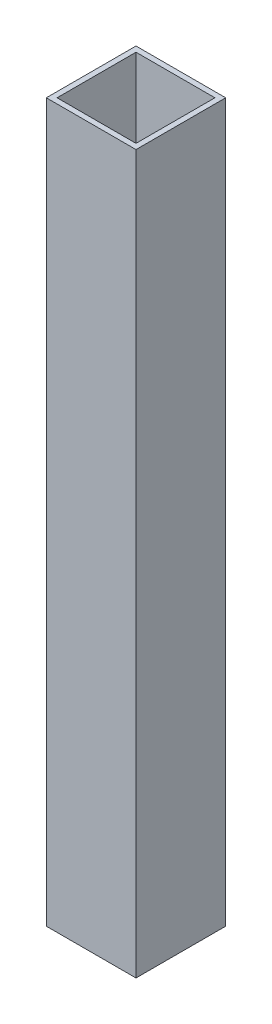
ISO-10303-21;
HEADER;
FILE_DESCRIPTION(('STEP AP214'),'2;1');
FILE_NAME('part.step','',(''),(''),'','','');
FILE_SCHEMA(('AUTOMOTIVE_DESIGN { 1 0 10303 214 1 1 1 1 }'));
ENDSEC;
DATA;
#1=APPLICATION_CONTEXT('core data for automotive mechanical design processes');
#2=APPLICATION_PROTOCOL_DEFINITION('international standard','automotive_design',2000,#1);
#3=PRODUCT_CONTEXT('',#1,'mechanical');
#4=PRODUCT('Part','Part','',(#3));
#5=PRODUCT_RELATED_PRODUCT_CATEGORY('part','',(#4));
#6=PRODUCT_DEFINITION_FORMATION('','',#4);
#7=PRODUCT_DEFINITION_CONTEXT('part definition',#1,'design');
#8=PRODUCT_DEFINITION('design','',#6,#7);
#9=PRODUCT_DEFINITION_SHAPE('','',#8);
#10=(LENGTH_UNIT() NAMED_UNIT(*) SI_UNIT(.MILLI.,.METRE.));
#11=(NAMED_UNIT(*) PLANE_ANGLE_UNIT() SI_UNIT($,.RADIAN.));
#12=(NAMED_UNIT(*) SI_UNIT($,.STERADIAN.) SOLID_ANGLE_UNIT());
#13=UNCERTAINTY_MEASURE_WITH_UNIT(LENGTH_MEASURE(1.E-05),#10,'distance_accuracy_value','');
#14=(GEOMETRIC_REPRESENTATION_CONTEXT(3) GLOBAL_UNCERTAINTY_ASSIGNED_CONTEXT((#13)) GLOBAL_UNIT_ASSIGNED_CONTEXT((#10,
#11,#12)) REPRESENTATION_CONTEXT('',''));
#15=CARTESIAN_POINT('',(0.,0.,0.));
#16=DIRECTION('',(0.,0.,1.));
#17=DIRECTION('',(1.,0.,0.));
#18=AXIS2_PLACEMENT_3D('',#15,#16,#17);
#19=CARTESIAN_POINT('',(0.,100.,0.));
#20=DIRECTION('',(0.,1.,0.));
#21=DIRECTION('',(0.,0.,1.));
#22=AXIS2_PLACEMENT_3D('',#19,#20,#21);
#23=PLANE('',#22);
#24=DIRECTION('',(0.,0.,1.));
#25=VECTOR('',#24,1.);
#26=CARTESIAN_POINT('',(-26.6277544150477,100.,-1.83717263154866));
#27=LINE('',#26,#25);
#28=CARTESIAN_POINT('',(-26.6277544150477,100.,-1.83717263154866));
#29=VERTEX_POINT('',#28);
#30=CARTESIAN_POINT('',(-26.6277544150477,100.,10.6628273684513));
#31=VERTEX_POINT('',#30);
#32=EDGE_CURVE('E138',#29,#31,#27,.T.);
#33=ORIENTED_EDGE('',*,*,#32,.T.);
#34=DIRECTION('',(1.,0.,0.));
#35=VECTOR('',#34,1.);
#36=CARTESIAN_POINT('',(-26.6277544150477,100.,10.6628273684513));
#37=LINE('',#36,#35);
#38=CARTESIAN_POINT('',(-14.1277544150477,100.,10.6628273684513));
#39=VERTEX_POINT('',#38);
#40=EDGE_CURVE('E141',#31,#39,#37,.T.);
#41=ORIENTED_EDGE('',*,*,#40,.T.);
#42=DIRECTION('',(0.,0.,-1.));
#43=VECTOR('',#42,1.);
#44=CARTESIAN_POINT('',(-14.1277544150477,100.,-1.83717263154866));
#45=LINE('',#44,#43);
#46=CARTESIAN_POINT('',(-14.1277544150477,100.,-1.83717263154866));
#47=VERTEX_POINT('',#46);
#48=EDGE_CURVE('E144',#39,#47,#45,.T.);
#49=ORIENTED_EDGE('',*,*,#48,.T.);
#50=DIRECTION('',(-1.,0.,0.));
#51=VECTOR('',#50,1.);
#52=CARTESIAN_POINT('',(-26.6277544150477,100.,-1.83717263154866));
#53=LINE('',#52,#51);
#54=EDGE_CURVE('E146',#47,#29,#53,.T.);
#55=ORIENTED_EDGE('',*,*,#54,.T.);
#56=EDGE_LOOP('',(#33,#41,#49,#55));
#57=FACE_BOUND('',#56,.T.);
#58=DIRECTION('',(-1.,0.,0.));
#59=VECTOR('',#58,1.);
#60=CARTESIAN_POINT('',(-25.8777544150477,100.,-1.08717263154866));
#61=LINE('',#60,#59);
#62=CARTESIAN_POINT('',(-14.8777544150477,100.,-1.08717263154866));
#63=VERTEX_POINT('',#62);
#64=CARTESIAN_POINT('',(-25.8777544150477,100.,-1.08717263154866));
#65=VERTEX_POINT('',#64);
#66=EDGE_CURVE('E110',#63,#65,#61,.T.);
#67=ORIENTED_EDGE('',*,*,#66,.F.);
#68=DIRECTION('',(0.,0.,-1.));
#69=VECTOR('',#68,1.);
#70=CARTESIAN_POINT('',(-14.8777544150477,100.,-1.08717263154866));
#71=LINE('',#70,#69);
#72=CARTESIAN_POINT('',(-14.8777544150477,100.,9.91282736845134));
#73=VERTEX_POINT('',#72);
#74=EDGE_CURVE('E102',#73,#63,#71,.T.);
#75=ORIENTED_EDGE('',*,*,#74,.F.);
#76=DIRECTION('',(1.,0.,0.));
#77=VECTOR('',#76,1.);
#78=CARTESIAN_POINT('',(-25.8777544150477,100.,9.91282736845134));
#79=LINE('',#78,#77);
#80=CARTESIAN_POINT('',(-25.8777544150477,100.,9.91282736845134));
#81=VERTEX_POINT('',#80);
#82=EDGE_CURVE('E124',#81,#73,#79,.T.);
#83=ORIENTED_EDGE('',*,*,#82,.F.);
#84=DIRECTION('',(0.,0.,1.));
#85=VECTOR('',#84,1.);
#86=CARTESIAN_POINT('',(-25.8777544150477,100.,-1.08717263154866));
#87=LINE('',#86,#85);
#88=EDGE_CURVE('E122',#65,#81,#87,.T.);
#89=ORIENTED_EDGE('',*,*,#88,.F.);
#90=EDGE_LOOP('',(#67,#75,#83,#89));
#91=FACE_BOUND('',#90,.T.);
#92=ADVANCED_FACE('F37',(#57,#91),#23,.T.);
#93=CARTESIAN_POINT('',(0.,0.,0.));
#94=DIRECTION('',(0.,1.,0.));
#95=DIRECTION('',(0.,0.,1.));
#96=AXIS2_PLACEMENT_3D('',#93,#94,#95);
#97=PLANE('',#96);
#98=DIRECTION('',(0.,0.,1.));
#99=VECTOR('',#98,1.);
#100=CARTESIAN_POINT('',(-26.6277544150477,0.,-1.83717263154866));
#101=LINE('',#100,#99);
#102=CARTESIAN_POINT('',(-26.6277544150477,0.,-1.83717263154866));
#103=VERTEX_POINT('',#102);
#104=CARTESIAN_POINT('',(-26.6277544150477,0.,10.6628273684513));
#105=VERTEX_POINT('',#104);
#106=EDGE_CURVE('E118',#103,#105,#101,.T.);
#107=ORIENTED_EDGE('',*,*,#106,.F.);
#108=DIRECTION('',(-1.,0.,0.));
#109=VECTOR('',#108,1.);
#110=CARTESIAN_POINT('',(-26.6277544150477,0.,-1.83717263154866));
#111=LINE('',#110,#109);
#112=CARTESIAN_POINT('',(-14.1277544150477,0.,-1.83717263154866));
#113=VERTEX_POINT('',#112);
#114=EDGE_CURVE('E142',#113,#103,#111,.T.);
#115=ORIENTED_EDGE('',*,*,#114,.F.);
#116=DIRECTION('',(0.,0.,-1.));
#117=VECTOR('',#116,1.);
#118=CARTESIAN_POINT('',(-14.1277544150477,0.,-1.83717263154866));
#119=LINE('',#118,#117);
#120=CARTESIAN_POINT('',(-14.1277544150477,0.,10.6628273684513));
#121=VERTEX_POINT('',#120);
#122=EDGE_CURVE('E153',#121,#113,#119,.T.);
#123=ORIENTED_EDGE('',*,*,#122,.F.);
#124=DIRECTION('',(1.,0.,0.));
#125=VECTOR('',#124,1.);
#126=CARTESIAN_POINT('',(-26.6277544150477,0.,10.6628273684513));
#127=LINE('',#126,#125);
#128=EDGE_CURVE('E151',#105,#121,#127,.T.);
#129=ORIENTED_EDGE('',*,*,#128,.F.);
#130=EDGE_LOOP('',(#107,#115,#123,#129));
#131=FACE_BOUND('',#130,.T.);
#132=DIRECTION('',(0.,0.,-1.));
#133=VECTOR('',#132,1.);
#134=CARTESIAN_POINT('',(-14.8777544150477,0.,-1.08717263154866));
#135=LINE('',#134,#133);
#136=CARTESIAN_POINT('',(-14.8777544150477,0.,9.91282736845134));
#137=VERTEX_POINT('',#136);
#138=CARTESIAN_POINT('',(-14.8777544150477,0.,-1.08717263154866));
#139=VERTEX_POINT('',#138);
#140=EDGE_CURVE('E60',#137,#139,#135,.T.);
#141=ORIENTED_EDGE('',*,*,#140,.T.);
#142=DIRECTION('',(-1.,0.,0.));
#143=VECTOR('',#142,1.);
#144=CARTESIAN_POINT('',(-25.8777544150477,0.,-1.08717263154866));
#145=LINE('',#144,#143);
#146=CARTESIAN_POINT('',(-25.8777544150477,0.,-1.08717263154866));
#147=VERTEX_POINT('',#146);
#148=EDGE_CURVE('E117',#139,#147,#145,.T.);
#149=ORIENTED_EDGE('',*,*,#148,.T.);
#150=DIRECTION('',(0.,0.,1.));
#151=VECTOR('',#150,1.);
#152=CARTESIAN_POINT('',(-25.8777544150477,0.,-1.08717263154866));
#153=LINE('',#152,#151);
#154=CARTESIAN_POINT('',(-25.8777544150477,0.,9.91282736845134));
#155=VERTEX_POINT('',#154);
#156=EDGE_CURVE('E130',#147,#155,#153,.T.);
#157=ORIENTED_EDGE('',*,*,#156,.T.);
#158=DIRECTION('',(1.,0.,0.));
#159=VECTOR('',#158,1.);
#160=CARTESIAN_POINT('',(-25.8777544150477,0.,9.91282736845134));
#161=LINE('',#160,#159);
#162=EDGE_CURVE('E111',#155,#137,#161,.T.);
#163=ORIENTED_EDGE('',*,*,#162,.T.);
#164=EDGE_LOOP('',(#141,#149,#157,#163));
#165=FACE_BOUND('',#164,.T.);
#166=ADVANCED_FACE('F171',(#131,#165),#97,.F.);
#167=CARTESIAN_POINT('',(-26.6277544150477,100.,-1.83717263154866));
#168=DIRECTION('',(1.,0.,0.));
#169=DIRECTION('',(0.,0.,-1.));
#170=AXIS2_PLACEMENT_3D('',#167,#168,#169);
#171=PLANE('',#170);
#172=ORIENTED_EDGE('',*,*,#106,.T.);
#173=DIRECTION('',(0.,-1.,0.));
#174=VECTOR('',#173,1.);
#175=CARTESIAN_POINT('',(-26.6277544150477,100.,10.6628273684513));
#176=LINE('',#175,#174);
#177=EDGE_CURVE('E11',#31,#105,#176,.T.);
#178=ORIENTED_EDGE('',*,*,#177,.F.);
#179=ORIENTED_EDGE('',*,*,#32,.F.);
#180=DIRECTION('',(0.,-1.,0.));
#181=VECTOR('',#180,1.);
#182=CARTESIAN_POINT('',(-26.6277544150477,100.,-1.83717263154866));
#183=LINE('',#182,#181);
#184=EDGE_CURVE('E148',#29,#103,#183,.T.);
#185=ORIENTED_EDGE('',*,*,#184,.T.);
#186=EDGE_LOOP('',(#172,#178,#179,#185));
#187=FACE_BOUND('',#186,.T.);
#188=ADVANCED_FACE('F39',(#187),#171,.F.);
#189=CARTESIAN_POINT('',(-26.6277544150477,100.,10.6628273684513));
#190=DIRECTION('',(0.,0.,-1.));
#191=DIRECTION('',(-1.,0.,0.));
#192=AXIS2_PLACEMENT_3D('',#189,#190,#191);
#193=PLANE('',#192);
#194=ORIENTED_EDGE('',*,*,#128,.T.);
#195=DIRECTION('',(0.,-1.,0.));
#196=VECTOR('',#195,1.);
#197=CARTESIAN_POINT('',(-14.1277544150477,100.,10.6628273684513));
#198=LINE('',#197,#196);
#199=EDGE_CURVE('E45',#39,#121,#198,.T.);
#200=ORIENTED_EDGE('',*,*,#199,.F.);
#201=ORIENTED_EDGE('',*,*,#40,.F.);
#202=ORIENTED_EDGE('',*,*,#177,.T.);
#203=EDGE_LOOP('',(#194,#200,#201,#202));
#204=FACE_BOUND('',#203,.T.);
#205=ADVANCED_FACE('F181',(#204),#193,.F.);
#206=CARTESIAN_POINT('',(-14.1277544150477,100.,-1.83717263154866));
#207=DIRECTION('',(-1.,0.,0.));
#208=DIRECTION('',(0.,0.,1.));
#209=AXIS2_PLACEMENT_3D('',#206,#207,#208);
#210=PLANE('',#209);
#211=ORIENTED_EDGE('',*,*,#122,.T.);
#212=DIRECTION('',(0.,-1.,0.));
#213=VECTOR('',#212,1.);
#214=CARTESIAN_POINT('',(-14.1277544150477,100.,-1.83717263154866));
#215=LINE('',#214,#213);
#216=EDGE_CURVE('E158',#47,#113,#215,.T.);
#217=ORIENTED_EDGE('',*,*,#216,.F.);
#218=ORIENTED_EDGE('',*,*,#48,.F.);
#219=ORIENTED_EDGE('',*,*,#199,.T.);
#220=EDGE_LOOP('',(#211,#217,#218,#219));
#221=FACE_BOUND('',#220,.T.);
#222=ADVANCED_FACE('F165',(#221),#210,.F.);
#223=CARTESIAN_POINT('',(-26.6277544150477,100.,-1.83717263154866));
#224=DIRECTION('',(0.,0.,1.));
#225=DIRECTION('',(1.,0.,0.));
#226=AXIS2_PLACEMENT_3D('',#223,#224,#225);
#227=PLANE('',#226);
#228=ORIENTED_EDGE('',*,*,#114,.T.);
#229=ORIENTED_EDGE('',*,*,#184,.F.);
#230=ORIENTED_EDGE('',*,*,#54,.F.);
#231=ORIENTED_EDGE('',*,*,#216,.T.);
#232=EDGE_LOOP('',(#228,#229,#230,#231));
#233=FACE_BOUND('',#232,.T.);
#234=ADVANCED_FACE('F175',(#233),#227,.F.);
#235=CARTESIAN_POINT('',(-14.8777544150477,100.,-1.08717263154866));
#236=DIRECTION('',(-1.,0.,0.));
#237=DIRECTION('',(0.,0.,1.));
#238=AXIS2_PLACEMENT_3D('',#235,#236,#237);
#239=PLANE('',#238);
#240=ORIENTED_EDGE('',*,*,#140,.F.);
#241=DIRECTION('',(0.,-1.,0.));
#242=VECTOR('',#241,1.);
#243=CARTESIAN_POINT('',(-14.8777544150477,100.,9.91282736845134));
#244=LINE('',#243,#242);
#245=EDGE_CURVE('E106',#73,#137,#244,.T.);
#246=ORIENTED_EDGE('',*,*,#245,.F.);
#247=ORIENTED_EDGE('',*,*,#74,.T.);
#248=DIRECTION('',(0.,-1.,0.));
#249=VECTOR('',#248,1.);
#250=CARTESIAN_POINT('',(-14.8777544150477,100.,-1.08717263154866));
#251=LINE('',#250,#249);
#252=EDGE_CURVE('E105',#63,#139,#251,.T.);
#253=ORIENTED_EDGE('',*,*,#252,.T.);
#254=EDGE_LOOP('',(#240,#246,#247,#253));
#255=FACE_BOUND('',#254,.T.);
#256=ADVANCED_FACE('F104',(#255),#239,.T.);
#257=CARTESIAN_POINT('',(-25.8777544150477,100.,-1.08717263154866));
#258=DIRECTION('',(0.,0.,1.));
#259=DIRECTION('',(1.,0.,0.));
#260=AXIS2_PLACEMENT_3D('',#257,#258,#259);
#261=PLANE('',#260);
#262=ORIENTED_EDGE('',*,*,#148,.F.);
#263=ORIENTED_EDGE('',*,*,#252,.F.);
#264=ORIENTED_EDGE('',*,*,#66,.T.);
#265=DIRECTION('',(0.,-1.,0.));
#266=VECTOR('',#265,1.);
#267=CARTESIAN_POINT('',(-25.8777544150477,100.,-1.08717263154866));
#268=LINE('',#267,#266);
#269=EDGE_CURVE('E119',#65,#147,#268,.T.);
#270=ORIENTED_EDGE('',*,*,#269,.T.);
#271=EDGE_LOOP('',(#262,#263,#264,#270));
#272=FACE_BOUND('',#271,.T.);
#273=ADVANCED_FACE('F114',(#272),#261,.T.);
#274=CARTESIAN_POINT('',(-25.8777544150477,100.,-1.08717263154866));
#275=DIRECTION('',(1.,0.,0.));
#276=DIRECTION('',(0.,0.,-1.));
#277=AXIS2_PLACEMENT_3D('',#274,#275,#276);
#278=PLANE('',#277);
#279=ORIENTED_EDGE('',*,*,#156,.F.);
#280=ORIENTED_EDGE('',*,*,#269,.F.);
#281=ORIENTED_EDGE('',*,*,#88,.T.);
#282=DIRECTION('',(0.,-1.,0.));
#283=VECTOR('',#282,1.);
#284=CARTESIAN_POINT('',(-25.8777544150477,100.,9.91282736845134));
#285=LINE('',#284,#283);
#286=EDGE_CURVE('E52',#81,#155,#285,.T.);
#287=ORIENTED_EDGE('',*,*,#286,.T.);
#288=EDGE_LOOP('',(#279,#280,#281,#287));
#289=FACE_BOUND('',#288,.T.);
#290=ADVANCED_FACE('F204',(#289),#278,.T.);
#291=CARTESIAN_POINT('',(-25.8777544150477,100.,9.91282736845134));
#292=DIRECTION('',(0.,0.,-1.));
#293=DIRECTION('',(-1.,0.,0.));
#294=AXIS2_PLACEMENT_3D('',#291,#292,#293);
#295=PLANE('',#294);
#296=ORIENTED_EDGE('',*,*,#162,.F.);
#297=ORIENTED_EDGE('',*,*,#286,.F.);
#298=ORIENTED_EDGE('',*,*,#82,.T.);
#299=ORIENTED_EDGE('',*,*,#245,.T.);
#300=EDGE_LOOP('',(#296,#297,#298,#299));
#301=FACE_BOUND('',#300,.T.);
#302=ADVANCED_FACE('F208',(#301),#295,.T.);
#303=CLOSED_SHELL('',(#92,#166,#188,#205,#222,#234,#256,#273,#290,#302));
#304=MANIFOLD_SOLID_BREP('B2',#303);
#305=ADVANCED_BREP_SHAPE_REPRESENTATION('',(#18,#304),#14);
#306=SHAPE_DEFINITION_REPRESENTATION(#9,#305);
ENDSEC;
END-ISO-10303-21;
